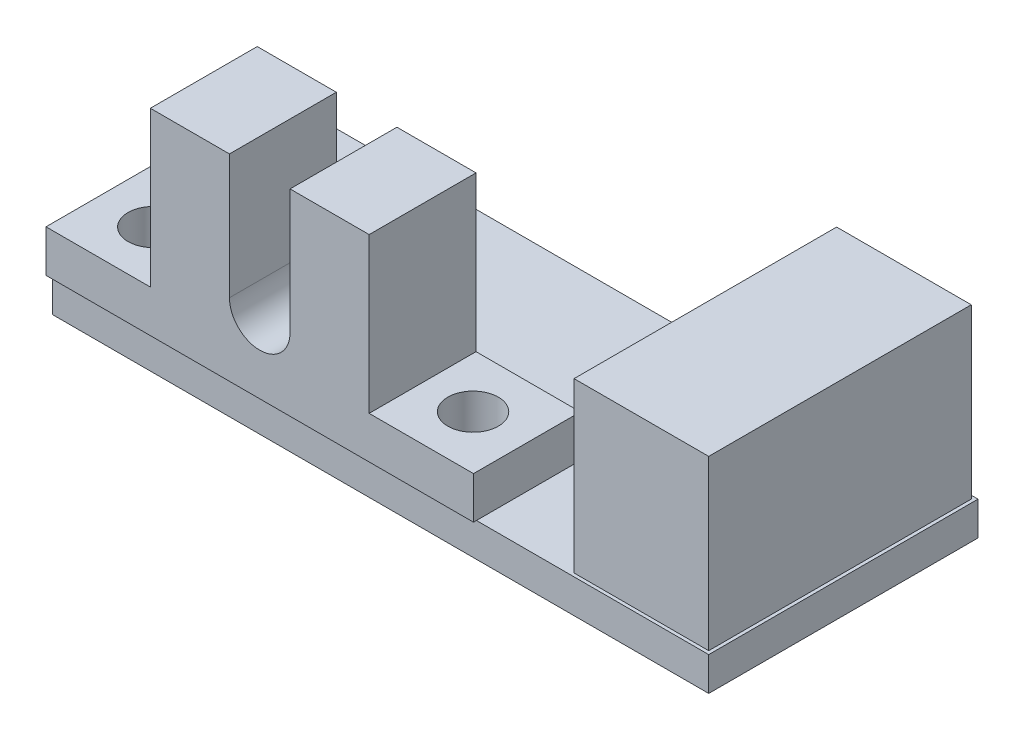
ISO-10303-21;
HEADER;
FILE_DESCRIPTION(('STEP AP214'),'2;1');
FILE_NAME('part.step','',(''),(''),'','','');
FILE_SCHEMA(('AUTOMOTIVE_DESIGN { 1 0 10303 214 1 1 1 1 }'));
ENDSEC;
DATA;
#1=APPLICATION_CONTEXT('core data for automotive mechanical design processes');
#2=APPLICATION_PROTOCOL_DEFINITION('international standard','automotive_design',2000,#1);
#3=PRODUCT_CONTEXT('',#1,'mechanical');
#4=PRODUCT('Part','Part','',(#3));
#5=PRODUCT_RELATED_PRODUCT_CATEGORY('part','',(#4));
#6=PRODUCT_DEFINITION_FORMATION('','',#4);
#7=PRODUCT_DEFINITION_CONTEXT('part definition',#1,'design');
#8=PRODUCT_DEFINITION('design','',#6,#7);
#9=PRODUCT_DEFINITION_SHAPE('','',#8);
#10=(LENGTH_UNIT() NAMED_UNIT(*) SI_UNIT(.MILLI.,.METRE.));
#11=(NAMED_UNIT(*) PLANE_ANGLE_UNIT() SI_UNIT($,.RADIAN.));
#12=(NAMED_UNIT(*) SI_UNIT($,.STERADIAN.) SOLID_ANGLE_UNIT());
#13=UNCERTAINTY_MEASURE_WITH_UNIT(LENGTH_MEASURE(1.E-05),#10,'distance_accuracy_value','');
#14=(GEOMETRIC_REPRESENTATION_CONTEXT(3) GLOBAL_UNCERTAINTY_ASSIGNED_CONTEXT((#13)) GLOBAL_UNIT_ASSIGNED_CONTEXT((#10,
#11,#12)) REPRESENTATION_CONTEXT('',''));
#15=CARTESIAN_POINT('',(0.,0.,0.));
#16=DIRECTION('',(0.,0.,1.));
#17=DIRECTION('',(1.,0.,0.));
#18=AXIS2_PLACEMENT_3D('',#15,#16,#17);
#19=CARTESIAN_POINT('',(0.,2.,0.));
#20=DIRECTION('',(0.,1.,0.));
#21=DIRECTION('',(0.,0.,1.));
#22=AXIS2_PLACEMENT_3D('',#19,#20,#21);
#23=PLANE('',#22);
#24=DIRECTION('',(-1.,0.,0.));
#25=VECTOR('',#24,1.);
#26=CARTESIAN_POINT('',(-19.7,2.,1.825));
#27=LINE('',#26,#25);
#28=CARTESIAN_POINT('',(5.70000000000001,2.,1.825));
#29=VERTEX_POINT('',#28);
#30=CARTESIAN_POINT('',(-19.5,2.,1.825));
#31=VERTEX_POINT('',#30);
#32=EDGE_CURVE('E311',#29,#31,#27,.T.);
#33=ORIENTED_EDGE('',*,*,#32,.F.);
#34=DIRECTION('',(0.,0.,-1.));
#35=VECTOR('',#34,1.);
#36=CARTESIAN_POINT('',(5.70000000000001,2.,1.825));
#37=LINE('',#36,#35);
#38=CARTESIAN_POINT('',(5.70000000000001,2.,8.));
#39=VERTEX_POINT('',#38);
#40=EDGE_CURVE('E13',#39,#29,#37,.T.);
#41=ORIENTED_EDGE('',*,*,#40,.F.);
#42=DIRECTION('',(1.,0.,0.));
#43=VECTOR('',#42,1.);
#44=CARTESIAN_POINT('',(-19.5,2.,8.));
#45=LINE('',#44,#43);
#46=CARTESIAN_POINT('',(19.5,2.,8.));
#47=VERTEX_POINT('',#46);
#48=EDGE_CURVE('E349',#39,#47,#45,.T.);
#49=ORIENTED_EDGE('',*,*,#48,.T.);
#50=DIRECTION('',(0.,0.,-1.));
#51=VECTOR('',#50,1.);
#52=CARTESIAN_POINT('',(19.5,2.,-8.));
#53=LINE('',#52,#51);
#54=CARTESIAN_POINT('',(19.5,2.,-8.));
#55=VERTEX_POINT('',#54);
#56=EDGE_CURVE('E354',#47,#55,#53,.T.);
#57=ORIENTED_EDGE('',*,*,#56,.T.);
#58=DIRECTION('',(-1.,0.,0.));
#59=VECTOR('',#58,1.);
#60=CARTESIAN_POINT('',(-19.5,2.,-8.));
#61=LINE('',#60,#59);
#62=CARTESIAN_POINT('',(-19.5,2.,-8.));
#63=VERTEX_POINT('',#62);
#64=EDGE_CURVE('E356',#55,#63,#61,.T.);
#65=ORIENTED_EDGE('',*,*,#64,.T.);
#66=DIRECTION('',(0.,0.,1.));
#67=VECTOR('',#66,1.);
#68=CARTESIAN_POINT('',(-19.5,2.,-8.));
#69=LINE('',#68,#67);
#70=EDGE_CURVE('E346',#63,#31,#69,.T.);
#71=ORIENTED_EDGE('',*,*,#70,.T.);
#72=EDGE_LOOP('',(#33,#41,#49,#57,#65,#71));
#73=FACE_BOUND('',#72,.T.);
#74=DIRECTION('',(-1.,0.,0.));
#75=VECTOR('',#74,1.);
#76=CARTESIAN_POINT('',(19.3,2.,-7.8));
#77=LINE('',#76,#75);
#78=CARTESIAN_POINT('',(19.3,2.,-7.8));
#79=VERTEX_POINT('',#78);
#80=CARTESIAN_POINT('',(11.3,2.,-7.8));
#81=VERTEX_POINT('',#80);
#82=EDGE_CURVE('E243',#79,#81,#77,.T.);
#83=ORIENTED_EDGE('',*,*,#82,.F.);
#84=DIRECTION('',(0.,0.,-1.));
#85=VECTOR('',#84,1.);
#86=CARTESIAN_POINT('',(19.3,2.,-7.8));
#87=LINE('',#86,#85);
#88=CARTESIAN_POINT('',(19.3,2.,7.8));
#89=VERTEX_POINT('',#88);
#90=EDGE_CURVE('E237',#89,#79,#87,.T.);
#91=ORIENTED_EDGE('',*,*,#90,.F.);
#92=DIRECTION('',(1.,0.,0.));
#93=VECTOR('',#92,1.);
#94=CARTESIAN_POINT('',(19.3,2.,7.8));
#95=LINE('',#94,#93);
#96=CARTESIAN_POINT('',(11.3,2.,7.8));
#97=VERTEX_POINT('',#96);
#98=EDGE_CURVE('E217',#97,#89,#95,.T.);
#99=ORIENTED_EDGE('',*,*,#98,.F.);
#100=DIRECTION('',(0.,0.,1.));
#101=VECTOR('',#100,1.);
#102=CARTESIAN_POINT('',(11.3,2.,-7.8));
#103=LINE('',#102,#101);
#104=EDGE_CURVE('E83',#81,#97,#103,.T.);
#105=ORIENTED_EDGE('',*,*,#104,.F.);
#106=EDGE_LOOP('',(#83,#91,#99,#105));
#107=FACE_BOUND('',#106,.T.);
#108=ADVANCED_FACE('F66',(#73,#107),#23,.T.);
#109=CARTESIAN_POINT('',(0.,4.5,0.));
#110=DIRECTION('',(0.,1.,0.));
#111=DIRECTION('',(0.,0.,1.));
#112=AXIS2_PLACEMENT_3D('',#109,#110,#111);
#113=PLANE('',#112);
#114=CARTESIAN_POINT('',(2.5,4.5,5.));
#115=DIRECTION('',(0.,1.,0.));
#116=DIRECTION('',(0.,0.,1.));
#117=AXIS2_PLACEMENT_3D('',#114,#115,#116);
#118=CIRCLE('',#117,1.5);
#119=CARTESIAN_POINT('',(2.5,4.5,6.5));
#120=VERTEX_POINT('',#119);
#121=EDGE_CURVE('E279',#120,#120,#118,.T.);
#122=ORIENTED_EDGE('',*,*,#121,.F.);
#123=EDGE_LOOP('',(#122));
#124=FACE_BOUND('',#123,.T.);
#125=DIRECTION('',(-1.,0.,0.));
#126=VECTOR('',#125,1.);
#127=CARTESIAN_POINT('',(-19.7,4.5,1.825));
#128=LINE('',#127,#126);
#129=CARTESIAN_POINT('',(5.70000000000001,4.5,1.825));
#130=VERTEX_POINT('',#129);
#131=CARTESIAN_POINT('',(-0.499999999999997,4.5,1.825));
#132=VERTEX_POINT('',#131);
#133=EDGE_CURVE('E317',#130,#132,#128,.T.);
#134=ORIENTED_EDGE('',*,*,#133,.T.);
#135=DIRECTION('',(0.,0.,1.));
#136=VECTOR('',#135,1.);
#137=CARTESIAN_POINT('',(-0.499999999999997,4.5,-9.43954615153225));
#138=LINE('',#137,#136);
#139=CARTESIAN_POINT('',(-0.500000000000004,4.5,8.175));
#140=VERTEX_POINT('',#139);
#141=EDGE_CURVE('E91',#132,#140,#138,.T.);
#142=ORIENTED_EDGE('',*,*,#141,.T.);
#143=DIRECTION('',(1.,0.,0.));
#144=VECTOR('',#143,1.);
#145=CARTESIAN_POINT('',(-19.7,4.5,8.175));
#146=LINE('',#145,#144);
#147=CARTESIAN_POINT('',(5.70000000000001,4.5,8.175));
#148=VERTEX_POINT('',#147);
#149=EDGE_CURVE('E310',#140,#148,#146,.T.);
#150=ORIENTED_EDGE('',*,*,#149,.T.);
#151=DIRECTION('',(0.,0.,-1.));
#152=VECTOR('',#151,1.);
#153=CARTESIAN_POINT('',(5.70000000000001,4.5,1.825));
#154=LINE('',#153,#152);
#155=EDGE_CURVE('E314',#148,#130,#154,.T.);
#156=ORIENTED_EDGE('',*,*,#155,.T.);
#157=EDGE_LOOP('',(#134,#142,#150,#156));
#158=FACE_BOUND('',#157,.T.);
#159=ADVANCED_FACE('F421',(#124,#158),#113,.T.);
#160=CARTESIAN_POINT('',(0.,0.,0.));
#161=DIRECTION('',(0.,1.,0.));
#162=DIRECTION('',(0.,0.,1.));
#163=AXIS2_PLACEMENT_3D('',#160,#161,#162);
#164=PLANE('',#163);
#165=CARTESIAN_POINT('',(-16.5,0.,5.));
#166=DIRECTION('',(0.,1.,0.));
#167=DIRECTION('',(0.,0.,1.));
#168=AXIS2_PLACEMENT_3D('',#165,#166,#167);
#169=CIRCLE('',#168,1.5);
#170=CARTESIAN_POINT('',(-16.5,0.,6.5));
#171=VERTEX_POINT('',#170);
#172=EDGE_CURVE('E342',#171,#171,#169,.T.);
#173=ORIENTED_EDGE('',*,*,#172,.T.);
#174=EDGE_LOOP('',(#173));
#175=FACE_BOUND('',#174,.T.);
#176=DIRECTION('',(0.,0.,1.));
#177=VECTOR('',#176,1.);
#178=CARTESIAN_POINT('',(-19.5,0.,-8.));
#179=LINE('',#178,#177);
#180=CARTESIAN_POINT('',(-19.5,0.,-8.));
#181=VERTEX_POINT('',#180);
#182=CARTESIAN_POINT('',(-19.5,0.,8.));
#183=VERTEX_POINT('',#182);
#184=EDGE_CURVE('E345',#181,#183,#179,.T.);
#185=ORIENTED_EDGE('',*,*,#184,.F.);
#186=DIRECTION('',(-1.,0.,0.));
#187=VECTOR('',#186,1.);
#188=CARTESIAN_POINT('',(-19.5,0.,-8.));
#189=LINE('',#188,#187);
#190=CARTESIAN_POINT('',(19.5,0.,-8.));
#191=VERTEX_POINT('',#190);
#192=EDGE_CURVE('E365',#191,#181,#189,.T.);
#193=ORIENTED_EDGE('',*,*,#192,.F.);
#194=DIRECTION('',(0.,0.,-1.));
#195=VECTOR('',#194,1.);
#196=CARTESIAN_POINT('',(19.5,0.,-8.));
#197=LINE('',#196,#195);
#198=CARTESIAN_POINT('',(19.5,0.,8.));
#199=VERTEX_POINT('',#198);
#200=EDGE_CURVE('E363',#199,#191,#197,.T.);
#201=ORIENTED_EDGE('',*,*,#200,.F.);
#202=DIRECTION('',(1.,0.,0.));
#203=VECTOR('',#202,1.);
#204=CARTESIAN_POINT('',(-19.5,0.,8.));
#205=LINE('',#204,#203);
#206=EDGE_CURVE('E361',#183,#199,#205,.T.);
#207=ORIENTED_EDGE('',*,*,#206,.F.);
#208=EDGE_LOOP('',(#185,#193,#201,#207));
#209=FACE_BOUND('',#208,.T.);
#210=CARTESIAN_POINT('',(2.5,0.,5.));
#211=DIRECTION('',(0.,1.,0.));
#212=DIRECTION('',(0.,0.,1.));
#213=AXIS2_PLACEMENT_3D('',#210,#211,#212);
#214=CIRCLE('',#213,1.5);
#215=CARTESIAN_POINT('',(2.5,0.,6.5));
#216=VERTEX_POINT('',#215);
#217=EDGE_CURVE('E339',#216,#216,#214,.T.);
#218=ORIENTED_EDGE('',*,*,#217,.T.);
#219=EDGE_LOOP('',(#218));
#220=FACE_BOUND('',#219,.T.);
#221=ADVANCED_FACE('F389',(#175,#209,#220),#164,.F.);
#222=CARTESIAN_POINT('',(-19.5,2.,-8.));
#223=DIRECTION('',(1.,0.,0.));
#224=DIRECTION('',(0.,0.,-1.));
#225=AXIS2_PLACEMENT_3D('',#222,#223,#224);
#226=PLANE('',#225);
#227=ORIENTED_EDGE('',*,*,#184,.T.);
#228=DIRECTION('',(0.,-1.,0.));
#229=VECTOR('',#228,1.);
#230=CARTESIAN_POINT('',(-19.5,2.,8.));
#231=LINE('',#230,#229);
#232=CARTESIAN_POINT('',(-19.5,2.,8.));
#233=VERTEX_POINT('',#232);
#234=EDGE_CURVE('E70',#233,#183,#231,.T.);
#235=ORIENTED_EDGE('',*,*,#234,.F.);
#236=EDGE_CURVE('E350',#31,#233,#69,.T.);
#237=ORIENTED_EDGE('',*,*,#236,.F.);
#238=ORIENTED_EDGE('',*,*,#70,.F.);
#239=DIRECTION('',(0.,-1.,0.));
#240=VECTOR('',#239,1.);
#241=CARTESIAN_POINT('',(-19.5,2.,-8.));
#242=LINE('',#241,#240);
#243=EDGE_CURVE('E358',#63,#181,#242,.T.);
#244=ORIENTED_EDGE('',*,*,#243,.T.);
#245=EDGE_LOOP('',(#227,#235,#237,#238,#244));
#246=FACE_BOUND('',#245,.T.);
#247=ADVANCED_FACE('F68',(#246),#226,.F.);
#248=CARTESIAN_POINT('',(-19.5,2.,8.));
#249=DIRECTION('',(0.,0.,-1.));
#250=DIRECTION('',(-1.,0.,0.));
#251=AXIS2_PLACEMENT_3D('',#248,#249,#250);
#252=PLANE('',#251);
#253=ORIENTED_EDGE('',*,*,#206,.T.);
#254=DIRECTION('',(0.,-1.,0.));
#255=VECTOR('',#254,1.);
#256=CARTESIAN_POINT('',(19.5,2.,8.));
#257=LINE('',#256,#255);
#258=EDGE_CURVE('E371',#47,#199,#257,.T.);
#259=ORIENTED_EDGE('',*,*,#258,.F.);
#260=ORIENTED_EDGE('',*,*,#48,.F.);
#261=EDGE_CURVE('E351',#233,#39,#45,.T.);
#262=ORIENTED_EDGE('',*,*,#261,.F.);
#263=ORIENTED_EDGE('',*,*,#234,.T.);
#264=EDGE_LOOP('',(#253,#259,#260,#262,#263));
#265=FACE_BOUND('',#264,.T.);
#266=ADVANCED_FACE('F380',(#265),#252,.F.);
#267=CARTESIAN_POINT('',(19.5,2.,-8.));
#268=DIRECTION('',(-1.,0.,0.));
#269=DIRECTION('',(0.,0.,1.));
#270=AXIS2_PLACEMENT_3D('',#267,#268,#269);
#271=PLANE('',#270);
#272=ORIENTED_EDGE('',*,*,#200,.T.);
#273=DIRECTION('',(0.,-1.,0.));
#274=VECTOR('',#273,1.);
#275=CARTESIAN_POINT('',(19.5,2.,-8.));
#276=LINE('',#275,#274);
#277=EDGE_CURVE('E369',#55,#191,#276,.T.);
#278=ORIENTED_EDGE('',*,*,#277,.F.);
#279=ORIENTED_EDGE('',*,*,#56,.F.);
#280=ORIENTED_EDGE('',*,*,#258,.T.);
#281=EDGE_LOOP('',(#272,#278,#279,#280));
#282=FACE_BOUND('',#281,.T.);
#283=ADVANCED_FACE('F392',(#282),#271,.F.);
#284=CARTESIAN_POINT('',(-19.5,2.,-8.));
#285=DIRECTION('',(0.,0.,1.));
#286=DIRECTION('',(1.,0.,0.));
#287=AXIS2_PLACEMENT_3D('',#284,#285,#286);
#288=PLANE('',#287);
#289=ORIENTED_EDGE('',*,*,#192,.T.);
#290=ORIENTED_EDGE('',*,*,#243,.F.);
#291=ORIENTED_EDGE('',*,*,#64,.F.);
#292=ORIENTED_EDGE('',*,*,#277,.T.);
#293=EDGE_LOOP('',(#289,#290,#291,#292));
#294=FACE_BOUND('',#293,.T.);
#295=ADVANCED_FACE('F395',(#294),#288,.F.);
#296=CARTESIAN_POINT('',(-16.5,2.,5.));
#297=DIRECTION('',(0.,-1.,0.));
#298=DIRECTION('',(0.,0.,-1.));
#299=AXIS2_PLACEMENT_3D('',#296,#297,#298);
#300=CYLINDRICAL_SURFACE('',#299,1.5);
#301=ORIENTED_EDGE('',*,*,#172,.F.);
#302=EDGE_LOOP('',(#301));
#303=FACE_BOUND('',#302,.T.);
#304=CARTESIAN_POINT('',(-16.5,4.5,5.));
#305=DIRECTION('',(0.,1.,0.));
#306=DIRECTION('',(0.,0.,1.));
#307=AXIS2_PLACEMENT_3D('',#304,#305,#306);
#308=CIRCLE('',#307,1.5);
#309=CARTESIAN_POINT('',(-16.5,4.5,6.5));
#310=VERTEX_POINT('',#309);
#311=EDGE_CURVE('E303',#310,#310,#308,.T.);
#312=ORIENTED_EDGE('',*,*,#311,.T.);
#313=EDGE_LOOP('',(#312));
#314=FACE_BOUND('',#313,.T.);
#315=ADVANCED_FACE('F448',(#303,#314),#300,.F.);
#316=CARTESIAN_POINT('',(2.5,2.,5.));
#317=DIRECTION('',(0.,-1.,0.));
#318=DIRECTION('',(0.,0.,-1.));
#319=AXIS2_PLACEMENT_3D('',#316,#317,#318);
#320=CYLINDRICAL_SURFACE('',#319,1.5);
#321=ORIENTED_EDGE('',*,*,#217,.F.);
#322=EDGE_LOOP('',(#321));
#323=FACE_BOUND('',#322,.T.);
#324=ORIENTED_EDGE('',*,*,#121,.T.);
#325=EDGE_LOOP('',(#324));
#326=FACE_BOUND('',#325,.T.);
#327=ADVANCED_FACE('F443',(#323,#326),#320,.F.);
#328=CARTESIAN_POINT('',(0.,2.,0.));
#329=DIRECTION('',(0.,1.,0.));
#330=DIRECTION('',(0.,0.,1.));
#331=AXIS2_PLACEMENT_3D('',#328,#329,#330);
#332=PLANE('',#331);
#333=CARTESIAN_POINT('',(-19.7,2.,1.825));
#334=VERTEX_POINT('',#333);
#335=EDGE_CURVE('E325',#31,#334,#27,.T.);
#336=ORIENTED_EDGE('',*,*,#335,.F.);
#337=ORIENTED_EDGE('',*,*,#236,.T.);
#338=ORIENTED_EDGE('',*,*,#261,.T.);
#339=CARTESIAN_POINT('',(5.70000000000001,2.,8.175));
#340=VERTEX_POINT('',#339);
#341=EDGE_CURVE('E76',#340,#39,#37,.T.);
#342=ORIENTED_EDGE('',*,*,#341,.F.);
#343=DIRECTION('',(1.,0.,0.));
#344=VECTOR('',#343,1.);
#345=CARTESIAN_POINT('',(-19.7,2.,8.175));
#346=LINE('',#345,#344);
#347=CARTESIAN_POINT('',(-19.7,2.,8.175));
#348=VERTEX_POINT('',#347);
#349=EDGE_CURVE('E322',#348,#340,#346,.T.);
#350=ORIENTED_EDGE('',*,*,#349,.F.);
#351=DIRECTION('',(0.,0.,1.));
#352=VECTOR('',#351,1.);
#353=CARTESIAN_POINT('',(-19.7,2.,1.825));
#354=LINE('',#353,#352);
#355=EDGE_CURVE('E306',#334,#348,#354,.T.);
#356=ORIENTED_EDGE('',*,*,#355,.F.);
#357=EDGE_LOOP('',(#336,#337,#338,#342,#350,#356));
#358=FACE_BOUND('',#357,.T.);
#359=ADVANCED_FACE('F401',(#358),#332,.F.);
#360=DIRECTION('',(0.,0.,1.));
#361=VECTOR('',#360,1.);
#362=CARTESIAN_POINT('',(-13.5,4.5,-9.43954615153225));
#363=LINE('',#362,#361);
#364=CARTESIAN_POINT('',(-13.5,4.5,1.825));
#365=VERTEX_POINT('',#364);
#366=CARTESIAN_POINT('',(-13.5,4.5,8.175));
#367=VERTEX_POINT('',#366);
#368=EDGE_CURVE('E291',#365,#367,#363,.T.);
#369=ORIENTED_EDGE('',*,*,#368,.F.);
#370=CARTESIAN_POINT('',(-19.7,4.5,1.825));
#371=VERTEX_POINT('',#370);
#372=EDGE_CURVE('E316',#365,#371,#128,.T.);
#373=ORIENTED_EDGE('',*,*,#372,.T.);
#374=DIRECTION('',(0.,0.,1.));
#375=VECTOR('',#374,1.);
#376=CARTESIAN_POINT('',(-19.7,4.5,1.825));
#377=LINE('',#376,#375);
#378=CARTESIAN_POINT('',(-19.7,4.5,8.175));
#379=VERTEX_POINT('',#378);
#380=EDGE_CURVE('E307',#371,#379,#377,.T.);
#381=ORIENTED_EDGE('',*,*,#380,.T.);
#382=EDGE_CURVE('E312',#379,#367,#146,.T.);
#383=ORIENTED_EDGE('',*,*,#382,.T.);
#384=EDGE_LOOP('',(#369,#373,#381,#383));
#385=FACE_BOUND('',#384,.T.);
#386=ORIENTED_EDGE('',*,*,#311,.F.);
#387=EDGE_LOOP('',(#386));
#388=FACE_BOUND('',#387,.T.);
#389=ADVANCED_FACE('F425',(#385,#388),#113,.T.);
#390=CARTESIAN_POINT('',(-19.7,4.5,1.825));
#391=DIRECTION('',(1.,0.,0.));
#392=DIRECTION('',(0.,0.,-1.));
#393=AXIS2_PLACEMENT_3D('',#390,#391,#392);
#394=PLANE('',#393);
#395=ORIENTED_EDGE('',*,*,#355,.T.);
#396=DIRECTION('',(0.,-1.,0.));
#397=VECTOR('',#396,1.);
#398=CARTESIAN_POINT('',(-19.7,4.5,8.175));
#399=LINE('',#398,#397);
#400=EDGE_CURVE('E336',#379,#348,#399,.T.);
#401=ORIENTED_EDGE('',*,*,#400,.F.);
#402=ORIENTED_EDGE('',*,*,#380,.F.);
#403=DIRECTION('',(0.,-1.,0.));
#404=VECTOR('',#403,1.);
#405=CARTESIAN_POINT('',(-19.7,4.5,1.825));
#406=LINE('',#405,#404);
#407=EDGE_CURVE('E319',#371,#334,#406,.T.);
#408=ORIENTED_EDGE('',*,*,#407,.T.);
#409=EDGE_LOOP('',(#395,#401,#402,#408));
#410=FACE_BOUND('',#409,.T.);
#411=ADVANCED_FACE('F413',(#410),#394,.F.);
#412=CARTESIAN_POINT('',(-19.7,4.5,8.175));
#413=DIRECTION('',(0.,0.,-1.));
#414=DIRECTION('',(-1.,0.,0.));
#415=AXIS2_PLACEMENT_3D('',#412,#413,#414);
#416=PLANE('',#415);
#417=ORIENTED_EDGE('',*,*,#349,.T.);
#418=DIRECTION('',(0.,-1.,0.));
#419=VECTOR('',#418,1.);
#420=CARTESIAN_POINT('',(5.70000000000001,4.5,8.175));
#421=LINE('',#420,#419);
#422=EDGE_CURVE('E333',#148,#340,#421,.T.);
#423=ORIENTED_EDGE('',*,*,#422,.F.);
#424=ORIENTED_EDGE('',*,*,#149,.F.);
#425=DIRECTION('',(0.,-1.,0.));
#426=VECTOR('',#425,1.);
#427=CARTESIAN_POINT('',(-0.499999999999997,0.,8.175));
#428=LINE('',#427,#426);
#429=CARTESIAN_POINT('',(-0.499999999999996,13.7,8.175));
#430=VERTEX_POINT('',#429);
#431=EDGE_CURVE('E251',#430,#140,#428,.T.);
#432=ORIENTED_EDGE('',*,*,#431,.F.);
#433=DIRECTION('',(1.,0.,0.));
#434=VECTOR('',#433,1.);
#435=CARTESIAN_POINT('',(0.,13.7,8.175));
#436=LINE('',#435,#434);
#437=CARTESIAN_POINT('',(-5.2,13.7,8.175));
#438=VERTEX_POINT('',#437);
#439=EDGE_CURVE('E254',#438,#430,#436,.T.);
#440=ORIENTED_EDGE('',*,*,#439,.F.);
#441=DIRECTION('',(0.,-1.,0.));
#442=VECTOR('',#441,1.);
#443=CARTESIAN_POINT('',(-5.2,0.,8.175));
#444=LINE('',#443,#442);
#445=CARTESIAN_POINT('',(-5.2,6.3,8.175));
#446=VERTEX_POINT('',#445);
#447=EDGE_CURVE('E231',#438,#446,#444,.T.);
#448=ORIENTED_EDGE('',*,*,#447,.T.);
#449=CARTESIAN_POINT('',(-6.99999999999999,6.3,8.175));
#450=DIRECTION('',(0.,0.,1.));
#451=DIRECTION('',(1.,0.,0.));
#452=AXIS2_PLACEMENT_3D('',#449,#450,#451);
#453=CIRCLE('',#452,1.8);
#454=CARTESIAN_POINT('',(-8.8,6.3,8.175));
#455=VERTEX_POINT('',#454);
#456=EDGE_CURVE('E265',#455,#446,#453,.T.);
#457=ORIENTED_EDGE('',*,*,#456,.F.);
#458=DIRECTION('',(0.,-1.,0.));
#459=VECTOR('',#458,1.);
#460=CARTESIAN_POINT('',(-8.8,0.,8.175));
#461=LINE('',#460,#459);
#462=CARTESIAN_POINT('',(-8.8,13.7,8.175));
#463=VERTEX_POINT('',#462);
#464=EDGE_CURVE('E281',#463,#455,#461,.T.);
#465=ORIENTED_EDGE('',*,*,#464,.F.);
#466=DIRECTION('',(1.,0.,0.));
#467=VECTOR('',#466,1.);
#468=CARTESIAN_POINT('',(0.,13.7,8.175));
#469=LINE('',#468,#467);
#470=CARTESIAN_POINT('',(-13.5,13.7,8.175));
#471=VERTEX_POINT('',#470);
#472=EDGE_CURVE('E284',#471,#463,#469,.T.);
#473=ORIENTED_EDGE('',*,*,#472,.F.);
#474=DIRECTION('',(0.,-1.,0.));
#475=VECTOR('',#474,1.);
#476=CARTESIAN_POINT('',(-13.5,0.,8.175));
#477=LINE('',#476,#475);
#478=EDGE_CURVE('E287',#471,#367,#477,.T.);
#479=ORIENTED_EDGE('',*,*,#478,.T.);
#480=ORIENTED_EDGE('',*,*,#382,.F.);
#481=ORIENTED_EDGE('',*,*,#400,.T.);
#482=EDGE_LOOP('',(#417,#423,#424,#432,#440,#448,#457,#465,#473,#479,#480,#481));
#483=FACE_BOUND('',#482,.T.);
#484=ADVANCED_FACE('F408',(#483),#416,.F.);
#485=CARTESIAN_POINT('',(5.70000000000001,4.5,1.825));
#486=DIRECTION('',(-1.,0.,0.));
#487=DIRECTION('',(0.,0.,1.));
#488=AXIS2_PLACEMENT_3D('',#485,#486,#487);
#489=PLANE('',#488);
#490=ORIENTED_EDGE('',*,*,#341,.T.);
#491=ORIENTED_EDGE('',*,*,#40,.T.);
#492=DIRECTION('',(0.,-1.,0.));
#493=VECTOR('',#492,1.);
#494=CARTESIAN_POINT('',(5.70000000000001,4.5,1.825));
#495=LINE('',#494,#493);
#496=EDGE_CURVE('E330',#130,#29,#495,.T.);
#497=ORIENTED_EDGE('',*,*,#496,.F.);
#498=ORIENTED_EDGE('',*,*,#155,.F.);
#499=ORIENTED_EDGE('',*,*,#422,.T.);
#500=EDGE_LOOP('',(#490,#491,#497,#498,#499));
#501=FACE_BOUND('',#500,.T.);
#502=ADVANCED_FACE('F403',(#501),#489,.F.);
#503=CARTESIAN_POINT('',(-19.7,4.5,1.825));
#504=DIRECTION('',(0.,0.,1.));
#505=DIRECTION('',(1.,0.,0.));
#506=AXIS2_PLACEMENT_3D('',#503,#504,#505);
#507=PLANE('',#506);
#508=ORIENTED_EDGE('',*,*,#32,.T.);
#509=ORIENTED_EDGE('',*,*,#335,.T.);
#510=ORIENTED_EDGE('',*,*,#407,.F.);
#511=ORIENTED_EDGE('',*,*,#372,.F.);
#512=DIRECTION('',(0.,1.,0.));
#513=VECTOR('',#512,1.);
#514=CARTESIAN_POINT('',(-13.5,0.,1.825));
#515=LINE('',#514,#513);
#516=CARTESIAN_POINT('',(-13.5,13.7,1.825));
#517=VERTEX_POINT('',#516);
#518=EDGE_CURVE('E273',#365,#517,#515,.T.);
#519=ORIENTED_EDGE('',*,*,#518,.T.);
#520=DIRECTION('',(-1.,0.,0.));
#521=VECTOR('',#520,1.);
#522=CARTESIAN_POINT('',(0.,13.7,1.825));
#523=LINE('',#522,#521);
#524=CARTESIAN_POINT('',(-8.8,13.7,1.825));
#525=VERTEX_POINT('',#524);
#526=EDGE_CURVE('E270',#525,#517,#523,.T.);
#527=ORIENTED_EDGE('',*,*,#526,.F.);
#528=DIRECTION('',(0.,1.,0.));
#529=VECTOR('',#528,1.);
#530=CARTESIAN_POINT('',(-8.8,0.,1.825));
#531=LINE('',#530,#529);
#532=CARTESIAN_POINT('',(-8.8,6.3,1.825));
#533=VERTEX_POINT('',#532);
#534=EDGE_CURVE('E274',#533,#525,#531,.T.);
#535=ORIENTED_EDGE('',*,*,#534,.F.);
#536=CARTESIAN_POINT('',(-6.99999999999999,6.3,1.825));
#537=DIRECTION('',(0.,0.,1.));
#538=DIRECTION('',(1.,0.,0.));
#539=AXIS2_PLACEMENT_3D('',#536,#537,#538);
#540=CIRCLE('',#539,1.8);
#541=CARTESIAN_POINT('',(-5.2,6.3,1.825));
#542=VERTEX_POINT('',#541);
#543=EDGE_CURVE('E276',#542,#533,#540,.F.);
#544=ORIENTED_EDGE('',*,*,#543,.F.);
#545=DIRECTION('',(0.,1.,0.));
#546=VECTOR('',#545,1.);
#547=CARTESIAN_POINT('',(-5.2,0.,1.825));
#548=LINE('',#547,#546);
#549=CARTESIAN_POINT('',(-5.2,13.7,1.825));
#550=VERTEX_POINT('',#549);
#551=EDGE_CURVE('E258',#542,#550,#548,.T.);
#552=ORIENTED_EDGE('',*,*,#551,.T.);
#553=DIRECTION('',(-1.,0.,0.));
#554=VECTOR('',#553,1.);
#555=CARTESIAN_POINT('',(0.,13.7,1.825));
#556=LINE('',#555,#554);
#557=CARTESIAN_POINT('',(-0.499999999999996,13.7,1.825));
#558=VERTEX_POINT('',#557);
#559=EDGE_CURVE('E255',#558,#550,#556,.T.);
#560=ORIENTED_EDGE('',*,*,#559,.F.);
#561=DIRECTION('',(0.,1.,0.));
#562=VECTOR('',#561,1.);
#563=CARTESIAN_POINT('',(-0.499999999999997,0.,1.825));
#564=LINE('',#563,#562);
#565=EDGE_CURVE('E248',#132,#558,#564,.T.);
#566=ORIENTED_EDGE('',*,*,#565,.F.);
#567=ORIENTED_EDGE('',*,*,#133,.F.);
#568=ORIENTED_EDGE('',*,*,#496,.T.);
#569=EDGE_LOOP('',(#508,#509,#510,#511,#519,#527,#535,#544,#552,#560,#566,#567,#568));
#570=FACE_BOUND('',#569,.T.);
#571=ADVANCED_FACE('F417',(#570),#507,.F.);
#572=CARTESIAN_POINT('',(-8.8,0.,-9.43954615153225));
#573=DIRECTION('',(-1.,0.,0.));
#574=DIRECTION('',(0.,0.,1.));
#575=AXIS2_PLACEMENT_3D('',#572,#573,#574);
#576=PLANE('',#575);
#577=DIRECTION('',(0.,0.,1.));
#578=VECTOR('',#577,1.);
#579=CARTESIAN_POINT('',(-8.8,6.3,-9.43954615153225));
#580=LINE('',#579,#578);
#581=EDGE_CURVE('E290',#533,#455,#580,.T.);
#582=ORIENTED_EDGE('',*,*,#581,.F.);
#583=ORIENTED_EDGE('',*,*,#534,.T.);
#584=DIRECTION('',(0.,0.,1.));
#585=VECTOR('',#584,1.);
#586=CARTESIAN_POINT('',(-8.8,13.7,-9.43954615153225));
#587=LINE('',#586,#585);
#588=EDGE_CURVE('E296',#525,#463,#587,.T.);
#589=ORIENTED_EDGE('',*,*,#588,.T.);
#590=ORIENTED_EDGE('',*,*,#464,.T.);
#591=EDGE_LOOP('',(#582,#583,#589,#590));
#592=FACE_BOUND('',#591,.T.);
#593=ADVANCED_FACE('F542',(#592),#576,.F.);
#594=CARTESIAN_POINT('',(0.,13.7,-9.43954615153225));
#595=DIRECTION('',(0.,-1.,0.));
#596=DIRECTION('',(0.,0.,-1.));
#597=AXIS2_PLACEMENT_3D('',#594,#595,#596);
#598=PLANE('',#597);
#599=ORIENTED_EDGE('',*,*,#588,.F.);
#600=ORIENTED_EDGE('',*,*,#526,.T.);
#601=DIRECTION('',(0.,0.,1.));
#602=VECTOR('',#601,1.);
#603=CARTESIAN_POINT('',(-13.5,13.7,-9.43954615153225));
#604=LINE('',#603,#602);
#605=EDGE_CURVE('E294',#517,#471,#604,.T.);
#606=ORIENTED_EDGE('',*,*,#605,.T.);
#607=ORIENTED_EDGE('',*,*,#472,.T.);
#608=EDGE_LOOP('',(#599,#600,#606,#607));
#609=FACE_BOUND('',#608,.T.);
#610=ADVANCED_FACE('F564',(#609),#598,.F.);
#611=CARTESIAN_POINT('',(-13.5,0.,-9.43954615153225));
#612=DIRECTION('',(-1.,0.,0.));
#613=DIRECTION('',(0.,0.,1.));
#614=AXIS2_PLACEMENT_3D('',#611,#612,#613);
#615=PLANE('',#614);
#616=ORIENTED_EDGE('',*,*,#518,.F.);
#617=ORIENTED_EDGE('',*,*,#368,.T.);
#618=ORIENTED_EDGE('',*,*,#478,.F.);
#619=ORIENTED_EDGE('',*,*,#605,.F.);
#620=EDGE_LOOP('',(#616,#617,#618,#619));
#621=FACE_BOUND('',#620,.T.);
#622=ADVANCED_FACE('F574',(#621),#615,.T.);
#623=CARTESIAN_POINT('',(-6.99999999999999,6.3,-9.43954615153225));
#624=DIRECTION('',(0.,0.,1.));
#625=DIRECTION('',(1.,0.,0.));
#626=AXIS2_PLACEMENT_3D('',#623,#624,#625);
#627=CYLINDRICAL_SURFACE('',#626,1.8);
#628=ORIENTED_EDGE('',*,*,#456,.T.);
#629=DIRECTION('',(0.,0.,1.));
#630=VECTOR('',#629,1.);
#631=CARTESIAN_POINT('',(-5.2,6.3,-9.43954615153225));
#632=LINE('',#631,#630);
#633=EDGE_CURVE('E256',#542,#446,#632,.T.);
#634=ORIENTED_EDGE('',*,*,#633,.F.);
#635=ORIENTED_EDGE('',*,*,#543,.T.);
#636=ORIENTED_EDGE('',*,*,#581,.T.);
#637=EDGE_LOOP('',(#628,#634,#635,#636));
#638=FACE_BOUND('',#637,.T.);
#639=ADVANCED_FACE('F584',(#638),#627,.F.);
#640=CARTESIAN_POINT('',(-0.499999999999997,0.,-9.43954615153225));
#641=DIRECTION('',(-1.,0.,0.));
#642=DIRECTION('',(0.,-1.,0.));
#643=AXIS2_PLACEMENT_3D('',#640,#641,#642);
#644=PLANE('',#643);
#645=ORIENTED_EDGE('',*,*,#141,.F.);
#646=ORIENTED_EDGE('',*,*,#565,.T.);
#647=DIRECTION('',(0.,0.,1.));
#648=VECTOR('',#647,1.);
#649=CARTESIAN_POINT('',(-0.499999999999996,13.7,-9.43954615153225));
#650=LINE('',#649,#648);
#651=EDGE_CURVE('E249',#558,#430,#650,.T.);
#652=ORIENTED_EDGE('',*,*,#651,.T.);
#653=ORIENTED_EDGE('',*,*,#431,.T.);
#654=EDGE_LOOP('',(#645,#646,#652,#653));
#655=FACE_BOUND('',#654,.T.);
#656=ADVANCED_FACE('F595',(#655),#644,.F.);
#657=CARTESIAN_POINT('',(0.,13.7,-9.43954615153225));
#658=DIRECTION('',(0.,-1.,0.));
#659=DIRECTION('',(1.,0.,0.));
#660=AXIS2_PLACEMENT_3D('',#657,#658,#659);
#661=PLANE('',#660);
#662=ORIENTED_EDGE('',*,*,#651,.F.);
#663=ORIENTED_EDGE('',*,*,#559,.T.);
#664=DIRECTION('',(0.,0.,1.));
#665=VECTOR('',#664,1.);
#666=CARTESIAN_POINT('',(-5.2,13.7,-9.43954615153225));
#667=LINE('',#666,#665);
#668=EDGE_CURVE('E252',#550,#438,#667,.T.);
#669=ORIENTED_EDGE('',*,*,#668,.T.);
#670=ORIENTED_EDGE('',*,*,#439,.T.);
#671=EDGE_LOOP('',(#662,#663,#669,#670));
#672=FACE_BOUND('',#671,.T.);
#673=ADVANCED_FACE('F604',(#672),#661,.F.);
#674=CARTESIAN_POINT('',(-5.2,0.,-9.43954615153225));
#675=DIRECTION('',(-1.,0.,0.));
#676=DIRECTION('',(0.,0.,1.));
#677=AXIS2_PLACEMENT_3D('',#674,#675,#676);
#678=PLANE('',#677);
#679=ORIENTED_EDGE('',*,*,#551,.F.);
#680=ORIENTED_EDGE('',*,*,#633,.T.);
#681=ORIENTED_EDGE('',*,*,#447,.F.);
#682=ORIENTED_EDGE('',*,*,#668,.F.);
#683=EDGE_LOOP('',(#679,#680,#681,#682));
#684=FACE_BOUND('',#683,.T.);
#685=ADVANCED_FACE('F614',(#684),#678,.T.);
#686=CARTESIAN_POINT('',(19.3,41.5316856006489,-7.8));
#687=DIRECTION('',(-1.,0.,0.));
#688=DIRECTION('',(0.,0.,1.));
#689=AXIS2_PLACEMENT_3D('',#686,#687,#688);
#690=PLANE('',#689);
#691=DIRECTION('',(0.,0.,-1.));
#692=VECTOR('',#691,1.);
#693=CARTESIAN_POINT('',(19.3,12.,-7.8));
#694=LINE('',#693,#692);
#695=CARTESIAN_POINT('',(19.3,12.,7.8));
#696=VERTEX_POINT('',#695);
#697=CARTESIAN_POINT('',(19.3,12.,-7.8));
#698=VERTEX_POINT('',#697);
#699=EDGE_CURVE('E226',#696,#698,#694,.T.);
#700=ORIENTED_EDGE('',*,*,#699,.F.);
#701=DIRECTION('',(0.,-1.,0.));
#702=VECTOR('',#701,1.);
#703=CARTESIAN_POINT('',(19.3,41.5316856006489,7.8));
#704=LINE('',#703,#702);
#705=EDGE_CURVE('E222',#696,#89,#704,.T.);
#706=ORIENTED_EDGE('',*,*,#705,.T.);
#707=ORIENTED_EDGE('',*,*,#90,.T.);
#708=DIRECTION('',(0.,-1.,0.));
#709=VECTOR('',#708,1.);
#710=CARTESIAN_POINT('',(19.3,41.5316856006489,-7.8));
#711=LINE('',#710,#709);
#712=EDGE_CURVE('E241',#698,#79,#711,.T.);
#713=ORIENTED_EDGE('',*,*,#712,.F.);
#714=EDGE_LOOP('',(#700,#706,#707,#713));
#715=FACE_BOUND('',#714,.T.);
#716=ADVANCED_FACE('F624',(#715),#690,.F.);
#717=CARTESIAN_POINT('',(19.3,41.5316856006489,-7.8));
#718=DIRECTION('',(0.,0.,1.));
#719=DIRECTION('',(1.,0.,0.));
#720=AXIS2_PLACEMENT_3D('',#717,#718,#719);
#721=PLANE('',#720);
#722=DIRECTION('',(-1.,0.,0.));
#723=VECTOR('',#722,1.);
#724=CARTESIAN_POINT('',(19.3,12.,-7.8));
#725=LINE('',#724,#723);
#726=CARTESIAN_POINT('',(11.3,12.,-7.8));
#727=VERTEX_POINT('',#726);
#728=EDGE_CURVE('E230',#698,#727,#725,.T.);
#729=ORIENTED_EDGE('',*,*,#728,.F.);
#730=ORIENTED_EDGE('',*,*,#712,.T.);
#731=ORIENTED_EDGE('',*,*,#82,.T.);
#732=DIRECTION('',(0.,-1.,0.));
#733=VECTOR('',#732,1.);
#734=CARTESIAN_POINT('',(11.3,41.5316856006489,-7.8));
#735=LINE('',#734,#733);
#736=EDGE_CURVE('E244',#727,#81,#735,.T.);
#737=ORIENTED_EDGE('',*,*,#736,.F.);
#738=EDGE_LOOP('',(#729,#730,#731,#737));
#739=FACE_BOUND('',#738,.T.);
#740=ADVANCED_FACE('F640',(#739),#721,.F.);
#741=CARTESIAN_POINT('',(11.3,41.5316856006489,-7.8));
#742=DIRECTION('',(1.,0.,0.));
#743=DIRECTION('',(0.,0.,-1.));
#744=AXIS2_PLACEMENT_3D('',#741,#742,#743);
#745=PLANE('',#744);
#746=DIRECTION('',(0.,0.,1.));
#747=VECTOR('',#746,1.);
#748=CARTESIAN_POINT('',(11.3,12.,-7.8));
#749=LINE('',#748,#747);
#750=CARTESIAN_POINT('',(11.3,12.,7.8));
#751=VERTEX_POINT('',#750);
#752=EDGE_CURVE('E212',#727,#751,#749,.T.);
#753=ORIENTED_EDGE('',*,*,#752,.F.);
#754=ORIENTED_EDGE('',*,*,#736,.T.);
#755=ORIENTED_EDGE('',*,*,#104,.T.);
#756=DIRECTION('',(0.,-1.,0.));
#757=VECTOR('',#756,1.);
#758=CARTESIAN_POINT('',(11.3,41.5316856006489,7.8));
#759=LINE('',#758,#757);
#760=EDGE_CURVE('E208',#751,#97,#759,.T.);
#761=ORIENTED_EDGE('',*,*,#760,.F.);
#762=EDGE_LOOP('',(#753,#754,#755,#761));
#763=FACE_BOUND('',#762,.T.);
#764=ADVANCED_FACE('F210',(#763),#745,.F.);
#765=CARTESIAN_POINT('',(19.3,41.5316856006489,7.8));
#766=DIRECTION('',(0.,0.,-1.));
#767=DIRECTION('',(-1.,0.,0.));
#768=AXIS2_PLACEMENT_3D('',#765,#766,#767);
#769=PLANE('',#768);
#770=DIRECTION('',(1.,0.,0.));
#771=VECTOR('',#770,1.);
#772=CARTESIAN_POINT('',(19.3,12.,7.8));
#773=LINE('',#772,#771);
#774=EDGE_CURVE('E220',#751,#696,#773,.T.);
#775=ORIENTED_EDGE('',*,*,#774,.F.);
#776=ORIENTED_EDGE('',*,*,#760,.T.);
#777=ORIENTED_EDGE('',*,*,#98,.T.);
#778=ORIENTED_EDGE('',*,*,#705,.F.);
#779=EDGE_LOOP('',(#775,#776,#777,#778));
#780=FACE_BOUND('',#779,.T.);
#781=ADVANCED_FACE('F221',(#780),#769,.F.);
#782=CARTESIAN_POINT('',(0.,12.,0.));
#783=DIRECTION('',(0.,1.,0.));
#784=DIRECTION('',(0.,0.,1.));
#785=AXIS2_PLACEMENT_3D('',#782,#783,#784);
#786=PLANE('',#785);
#787=ORIENTED_EDGE('',*,*,#774,.T.);
#788=ORIENTED_EDGE('',*,*,#699,.T.);
#789=ORIENTED_EDGE('',*,*,#728,.T.);
#790=ORIENTED_EDGE('',*,*,#752,.T.);
#791=EDGE_LOOP('',(#787,#788,#789,#790));
#792=FACE_BOUND('',#791,.T.);
#793=ADVANCED_FACE('F229',(#792),#786,.T.);
#794=CLOSED_SHELL('',(#108,#159,#221,#247,#266,#283,#295,#315,#327,#359,#389,#411,#484,#502,
#571,#593,#610,#622,#639,#656,#673,#685,#716,#740,#764,#781,#793));
#795=MANIFOLD_SOLID_BREP('B2',#794);
#796=ADVANCED_BREP_SHAPE_REPRESENTATION('',(#18,#795),#14);
#797=SHAPE_DEFINITION_REPRESENTATION(#9,#796);
ENDSEC;
END-ISO-10303-21;
